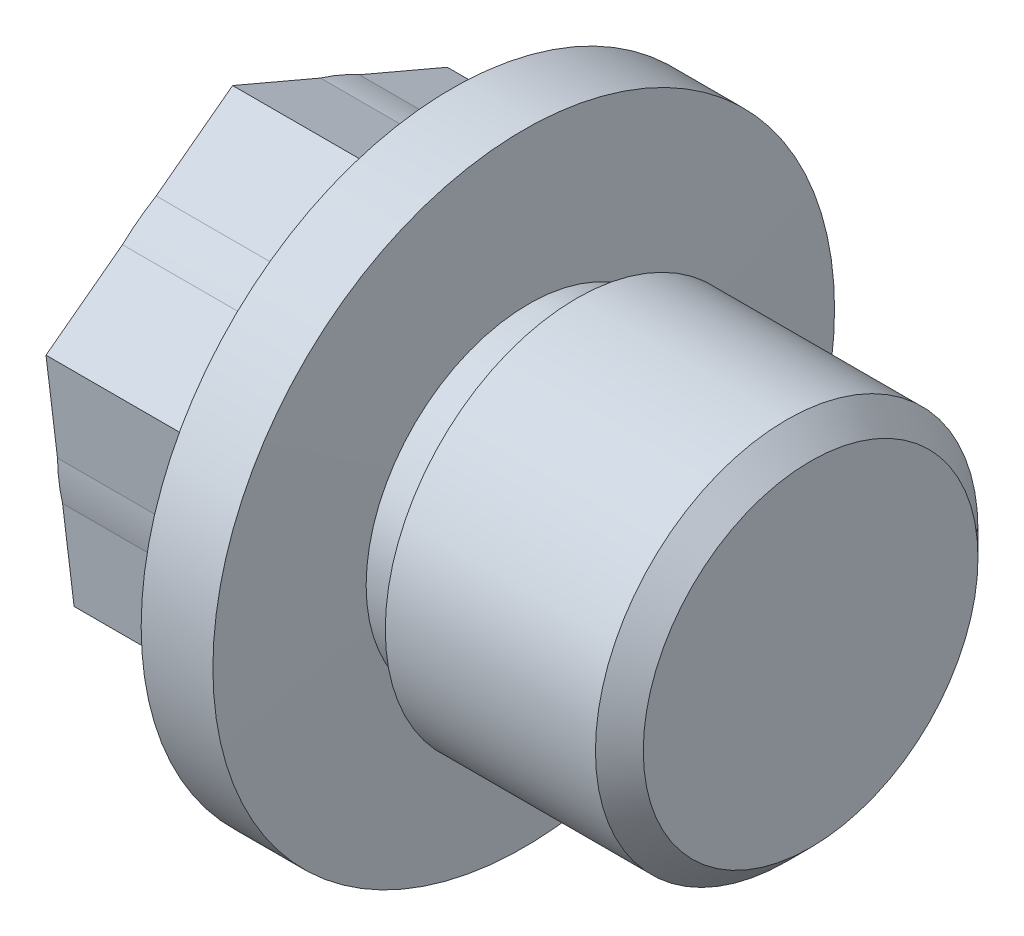
ISO-10303-21;
HEADER;
FILE_DESCRIPTION(('STEP AP214'),'2;1');
FILE_NAME('part.step','',(''),(''),'','','');
FILE_SCHEMA(('AUTOMOTIVE_DESIGN { 1 0 10303 214 1 1 1 1 }'));
ENDSEC;
DATA;
#1=APPLICATION_CONTEXT('core data for automotive mechanical design processes');
#2=APPLICATION_PROTOCOL_DEFINITION('international standard','automotive_design',2000,#1);
#3=PRODUCT_CONTEXT('',#1,'mechanical');
#4=PRODUCT('Part','Part','',(#3));
#5=PRODUCT_RELATED_PRODUCT_CATEGORY('part','',(#4));
#6=PRODUCT_DEFINITION_FORMATION('','',#4);
#7=PRODUCT_DEFINITION_CONTEXT('part definition',#1,'design');
#8=PRODUCT_DEFINITION('design','',#6,#7);
#9=PRODUCT_DEFINITION_SHAPE('','',#8);
#10=(LENGTH_UNIT() NAMED_UNIT(*) SI_UNIT(.MILLI.,.METRE.));
#11=(NAMED_UNIT(*) PLANE_ANGLE_UNIT() SI_UNIT($,.RADIAN.));
#12=(NAMED_UNIT(*) SI_UNIT($,.STERADIAN.) SOLID_ANGLE_UNIT());
#13=UNCERTAINTY_MEASURE_WITH_UNIT(LENGTH_MEASURE(1.E-05),#10,'distance_accuracy_value','');
#14=(GEOMETRIC_REPRESENTATION_CONTEXT(3) GLOBAL_UNCERTAINTY_ASSIGNED_CONTEXT((#13)) GLOBAL_UNIT_ASSIGNED_CONTEXT((#10,
#11,#12)) REPRESENTATION_CONTEXT('',''));
#15=CARTESIAN_POINT('',(0.,0.,0.));
#16=DIRECTION('',(0.,0.,1.));
#17=DIRECTION('',(1.,0.,0.));
#18=AXIS2_PLACEMENT_3D('',#15,#16,#17);
#19=CARTESIAN_POINT('',(0.,0.,0.));
#20=DIRECTION('',(-1.,0.,0.));
#21=DIRECTION('',(0.,0.,1.));
#22=AXIS2_PLACEMENT_3D('',#19,#20,#21);
#23=CYLINDRICAL_SURFACE('',#22,8.5);
#24=CARTESIAN_POINT('',(8.00000000000001,0.,0.));
#25=DIRECTION('',(-1.,0.,0.));
#26=DIRECTION('',(0.,0.,1.));
#27=AXIS2_PLACEMENT_3D('',#24,#25,#26);
#28=CIRCLE('',#27,8.5);
#29=CARTESIAN_POINT('',(8.00000000000001,-8.12297277686763,2.50346025857556));
#30=VERTEX_POINT('',#29);
#31=CARTESIAN_POINT('',(8.00000000000001,-7.43086157653214,4.1270202604807));
#32=VERTEX_POINT('',#31);
#33=EDGE_CURVE('E410',#30,#32,#28,.T.);
#34=ORIENTED_EDGE('',*,*,#33,.T.);
#35=DIRECTION('',(-1.,0.,0.));
#36=VECTOR('',#35,1.);
#37=CARTESIAN_POINT('',(0.,-7.43086157653215,4.12702026048069));
#38=LINE('',#37,#36);
#39=CARTESIAN_POINT('',(0.,-7.43086157653215,4.12702026048069));
#40=VERTEX_POINT('',#39);
#41=EDGE_CURVE('E295',#32,#40,#38,.T.);
#42=ORIENTED_EDGE('',*,*,#41,.T.);
#43=CARTESIAN_POINT('',(0.,0.,0.));
#44=DIRECTION('',(-1.,0.,0.));
#45=DIRECTION('',(0.,0.,1.));
#46=AXIS2_PLACEMENT_3D('',#43,#44,#45);
#47=CIRCLE('',#46,8.5);
#48=CARTESIAN_POINT('',(0.,-8.12297277686763,2.50346025857558));
#49=VERTEX_POINT('',#48);
#50=EDGE_CURVE('E453',#49,#40,#47,.T.);
#51=ORIENTED_EDGE('',*,*,#50,.F.);
#52=DIRECTION('',(-1.,0.,0.));
#53=VECTOR('',#52,1.);
#54=CARTESIAN_POINT('',(0.,-8.12297277686763,2.50346025857558));
#55=LINE('',#54,#53);
#56=EDGE_CURVE('E286',#49,#30,#55,.F.);
#57=ORIENTED_EDGE('',*,*,#56,.T.);
#58=EDGE_LOOP('',(#34,#42,#51,#57));
#59=FACE_BOUND('',#58,.T.);
#60=ADVANCED_FACE('F47',(#59),#23,.T.);
#61=CARTESIAN_POINT('',(8.00000000000001,-1.89342620714258,8.28643090830458));
#62=VERTEX_POINT('',#61);
#63=CARTESIAN_POINT('',(8.00000000000001,-0.141326400756689,8.49882502752287));
#64=VERTEX_POINT('',#63);
#65=EDGE_CURVE('E316',#62,#64,#28,.T.);
#66=ORIENTED_EDGE('',*,*,#65,.T.);
#67=DIRECTION('',(-1.,0.,0.));
#68=VECTOR('',#67,1.);
#69=CARTESIAN_POINT('',(0.,-0.141326400756724,8.49882502752287));
#70=LINE('',#69,#68);
#71=CARTESIAN_POINT('',(0.,-0.141326400756724,8.49882502752287));
#72=VERTEX_POINT('',#71);
#73=EDGE_CURVE('E284',#64,#72,#70,.T.);
#74=ORIENTED_EDGE('',*,*,#73,.T.);
#75=CARTESIAN_POINT('',(0.,-1.89342620714256,8.28643090830462));
#76=VERTEX_POINT('',#75);
#77=EDGE_CURVE('E321',#76,#72,#47,.T.);
#78=ORIENTED_EDGE('',*,*,#77,.F.);
#79=DIRECTION('',(-1.,0.,0.));
#80=VECTOR('',#79,1.);
#81=CARTESIAN_POINT('',(0.,-1.89342620714256,8.28643090830462));
#82=LINE('',#81,#80);
#83=EDGE_CURVE('E278',#76,#62,#82,.F.);
#84=ORIENTED_EDGE('',*,*,#83,.T.);
#85=EDGE_LOOP('',(#66,#74,#78,#84));
#86=FACE_BOUND('',#85,.T.);
#87=ADVANCED_FACE('F366',(#86),#23,.T.);
#88=CARTESIAN_POINT('',(8.00000000000001,6.22954656972507,5.78297064972906));
#89=VERTEX_POINT('',#88);
#90=CARTESIAN_POINT('',(8.00000000000001,7.28953517577547,4.37180476704223));
#91=VERTEX_POINT('',#90);
#92=EDGE_CURVE('E320',#89,#91,#28,.T.);
#93=ORIENTED_EDGE('',*,*,#92,.T.);
#94=DIRECTION('',(-1.,0.,0.));
#95=VECTOR('',#94,1.);
#96=CARTESIAN_POINT('',(0.,7.28953517577547,4.37180476704223));
#97=LINE('',#96,#95);
#98=CARTESIAN_POINT('',(0.,7.28953517577547,4.37180476704223));
#99=VERTEX_POINT('',#98);
#100=EDGE_CURVE('E277',#91,#99,#97,.T.);
#101=ORIENTED_EDGE('',*,*,#100,.T.);
#102=CARTESIAN_POINT('',(0.,6.22954656972507,5.78297064972906));
#103=VERTEX_POINT('',#102);
#104=EDGE_CURVE('E323',#103,#99,#47,.T.);
#105=ORIENTED_EDGE('',*,*,#104,.F.);
#106=DIRECTION('',(-1.,0.,0.));
#107=VECTOR('',#106,1.);
#108=CARTESIAN_POINT('',(0.,6.22954656972507,5.78297064972906));
#109=LINE('',#108,#107);
#110=EDGE_CURVE('E275',#103,#89,#109,.F.);
#111=ORIENTED_EDGE('',*,*,#110,.T.);
#112=EDGE_LOOP('',(#93,#101,#105,#111));
#113=FACE_BOUND('',#112,.T.);
#114=ADVANCED_FACE('F374',(#113),#23,.T.);
#115=CARTESIAN_POINT('',(8.00000000000001,8.12297277686767,-2.50346025857556));
#116=VERTEX_POINT('',#115);
#117=CARTESIAN_POINT('',(8.00000000000001,7.43086157653216,-4.12702026048067));
#118=VERTEX_POINT('',#117);
#119=EDGE_CURVE('E325',#116,#118,#28,.T.);
#120=ORIENTED_EDGE('',*,*,#119,.T.);
#121=DIRECTION('',(-1.,0.,0.));
#122=VECTOR('',#121,1.);
#123=CARTESIAN_POINT('',(0.,7.43086157653216,-4.12702026048067));
#124=LINE('',#123,#122);
#125=CARTESIAN_POINT('',(0.,7.43086157653216,-4.12702026048067));
#126=VERTEX_POINT('',#125);
#127=EDGE_CURVE('E268',#118,#126,#124,.T.);
#128=ORIENTED_EDGE('',*,*,#127,.T.);
#129=CARTESIAN_POINT('',(0.,8.12297277686767,-2.50346025857556));
#130=VERTEX_POINT('',#129);
#131=EDGE_CURVE('E330',#130,#126,#47,.T.);
#132=ORIENTED_EDGE('',*,*,#131,.F.);
#133=DIRECTION('',(-1.,0.,0.));
#134=VECTOR('',#133,1.);
#135=CARTESIAN_POINT('',(0.,8.12297277686767,-2.50346025857556));
#136=LINE('',#135,#134);
#137=EDGE_CURVE('E262',#130,#116,#136,.F.);
#138=ORIENTED_EDGE('',*,*,#137,.T.);
#139=EDGE_LOOP('',(#120,#128,#132,#138));
#140=FACE_BOUND('',#139,.T.);
#141=ADVANCED_FACE('F393',(#140),#23,.T.);
#142=CARTESIAN_POINT('',(8.00000000000001,1.89342620714259,-8.28643090830458));
#143=VERTEX_POINT('',#142);
#144=CARTESIAN_POINT('',(8.00000000000001,0.141326400756751,-8.49882502752286));
#145=VERTEX_POINT('',#144);
#146=EDGE_CURVE('E399',#143,#145,#28,.T.);
#147=ORIENTED_EDGE('',*,*,#146,.T.);
#148=DIRECTION('',(-1.,0.,0.));
#149=VECTOR('',#148,1.);
#150=CARTESIAN_POINT('',(0.,0.141326400756703,-8.49882502752283));
#151=LINE('',#150,#149);
#152=CARTESIAN_POINT('',(0.,0.141326400756703,-8.49882502752283));
#153=VERTEX_POINT('',#152);
#154=EDGE_CURVE('E261',#145,#153,#151,.T.);
#155=ORIENTED_EDGE('',*,*,#154,.T.);
#156=CARTESIAN_POINT('',(0.,1.89342620714262,-8.28643090830457));
#157=VERTEX_POINT('',#156);
#158=EDGE_CURVE('E190',#157,#153,#47,.T.);
#159=ORIENTED_EDGE('',*,*,#158,.F.);
#160=DIRECTION('',(-1.,0.,0.));
#161=VECTOR('',#160,1.);
#162=CARTESIAN_POINT('',(0.,1.89342620714262,-8.28643090830457));
#163=LINE('',#162,#161);
#164=EDGE_CURVE('E260',#157,#143,#163,.F.);
#165=ORIENTED_EDGE('',*,*,#164,.T.);
#166=EDGE_LOOP('',(#147,#155,#159,#165));
#167=FACE_BOUND('',#166,.T.);
#168=ADVANCED_FACE('F385',(#167),#23,.T.);
#169=CARTESIAN_POINT('',(0.,0.,0.));
#170=DIRECTION('',(1.,0.,0.));
#171=DIRECTION('',(0.,0.,-1.));
#172=AXIS2_PLACEMENT_3D('',#169,#170,#171);
#173=PLANE('',#172);
#174=CARTESIAN_POINT('',(0.,-6.22954656972502,-5.78297064972902));
#175=VERTEX_POINT('',#174);
#176=CARTESIAN_POINT('',(0.,-7.28953517577544,-4.37180476704217));
#177=VERTEX_POINT('',#176);
#178=EDGE_CURVE('E450',#175,#177,#47,.T.);
#179=ORIENTED_EDGE('',*,*,#178,.T.);
#180=DIRECTION('',(0.,-0.600585180639857,0.799560779925945));
#181=VECTOR('',#180,1.);
#182=CARTESIAN_POINT('',(0.,-6.75954087275023,-5.0773877083856));
#183=LINE('',#182,#181);
#184=CARTESIAN_POINT('',(0.,-9.69097203296675,-1.17476496590499));
#185=VERTEX_POINT('',#184);
#186=EDGE_CURVE('E209',#177,#185,#183,.T.);
#187=ORIENTED_EDGE('',*,*,#186,.T.);
#188=DIRECTION('',(0.,0.392147356965642,0.919902413533558));
#189=VECTOR('',#188,1.);
#190=CARTESIAN_POINT('',(0.,-7.77691717669989,3.31524025952815));
#191=LINE('',#190,#189);
#192=EDGE_CURVE('E214',#185,#49,#191,.T.);
#193=ORIENTED_EDGE('',*,*,#192,.T.);
#194=ORIENTED_EDGE('',*,*,#50,.T.);
#195=CARTESIAN_POINT('',(0.,-5.86286232043304,7.80524548496124));
#196=VERTEX_POINT('',#195);
#197=EDGE_CURVE('E207',#40,#196,#191,.T.);
#198=ORIENTED_EDGE('',*,*,#197,.T.);
#199=DIRECTION('',(0.,0.992732537605499,0.120341633607613));
#200=VECTOR('',#199,1.);
#201=CARTESIAN_POINT('',(0.,-1.01737630394962,8.39262796791378));
#202=LINE('',#201,#200);
#203=EDGE_CURVE('E430',#196,#76,#202,.T.);
#204=ORIENTED_EDGE('',*,*,#203,.T.);
#205=ORIENTED_EDGE('',*,*,#77,.T.);
#206=CARTESIAN_POINT('',(0.,3.82810971253376,8.98001045086626));
#207=VERTEX_POINT('',#206);
#208=EDGE_CURVE('E424',#72,#207,#202,.T.);
#209=ORIENTED_EDGE('',*,*,#208,.T.);
#210=DIRECTION('',(0.,0.600585180639857,-0.799560779925945));
#211=VECTOR('',#210,1.);
#212=CARTESIAN_POINT('',(0.,6.75954087275024,5.0773877083856));
#213=LINE('',#212,#211);
#214=EDGE_CURVE('E434',#207,#103,#213,.T.);
#215=ORIENTED_EDGE('',*,*,#214,.T.);
#216=ORIENTED_EDGE('',*,*,#104,.T.);
#217=CARTESIAN_POINT('',(0.,9.69097203296677,1.17476496590502));
#218=VERTEX_POINT('',#217);
#219=EDGE_CURVE('E435',#99,#218,#213,.T.);
#220=ORIENTED_EDGE('',*,*,#219,.T.);
#221=DIRECTION('',(0.,-0.392147356965642,-0.919902413533558));
#222=VECTOR('',#221,1.);
#223=CARTESIAN_POINT('',(0.,7.77691717669993,-3.3152402595281));
#224=LINE('',#223,#222);
#225=EDGE_CURVE('E195',#218,#130,#224,.T.);
#226=ORIENTED_EDGE('',*,*,#225,.T.);
#227=ORIENTED_EDGE('',*,*,#131,.T.);
#228=CARTESIAN_POINT('',(0.,5.86286232043304,-7.80524548496124));
#229=VERTEX_POINT('',#228);
#230=EDGE_CURVE('E437',#126,#229,#224,.T.);
#231=ORIENTED_EDGE('',*,*,#230,.T.);
#232=DIRECTION('',(0.,-0.992732537605499,-0.120341633607613));
#233=VECTOR('',#232,1.);
#234=CARTESIAN_POINT('',(0.,1.01737630394968,-8.39262796791372));
#235=LINE('',#234,#233);
#236=EDGE_CURVE('E193',#229,#157,#235,.T.);
#237=ORIENTED_EDGE('',*,*,#236,.T.);
#238=ORIENTED_EDGE('',*,*,#158,.T.);
#239=CARTESIAN_POINT('',(0.,-3.82810971253371,-8.98001045086623));
#240=VERTEX_POINT('',#239);
#241=EDGE_CURVE('E176',#153,#240,#235,.T.);
#242=ORIENTED_EDGE('',*,*,#241,.T.);
#243=EDGE_CURVE('E181',#240,#175,#183,.T.);
#244=ORIENTED_EDGE('',*,*,#243,.T.);
#245=EDGE_LOOP('',(#179,#187,#193,#194,#198,#204,#205,#209,#215,#216,#220,#226,#227,#231,#237,
#238,#242,#244));
#246=FACE_BOUND('',#245,.T.);
#247=ADVANCED_FACE('F182',(#246),#173,.F.);
#248=CARTESIAN_POINT('',(8.00000000000001,-6.22954656972502,-5.78297064972902));
#249=VERTEX_POINT('',#248);
#250=CARTESIAN_POINT('',(8.00000000000001,-7.28953517577544,-4.37180476704217));
#251=VERTEX_POINT('',#250);
#252=EDGE_CURVE('E405',#249,#251,#28,.T.);
#253=ORIENTED_EDGE('',*,*,#252,.T.);
#254=DIRECTION('',(-1.,0.,0.));
#255=VECTOR('',#254,1.);
#256=CARTESIAN_POINT('',(0.,-7.28953517577544,-4.37180476704217));
#257=LINE('',#256,#255);
#258=EDGE_CURVE('E251',#251,#177,#257,.T.);
#259=ORIENTED_EDGE('',*,*,#258,.T.);
#260=ORIENTED_EDGE('',*,*,#178,.F.);
#261=DIRECTION('',(-1.,0.,0.));
#262=VECTOR('',#261,1.);
#263=CARTESIAN_POINT('',(0.,-6.22954656972502,-5.78297064972902));
#264=LINE('',#263,#262);
#265=EDGE_CURVE('E210',#175,#249,#264,.F.);
#266=ORIENTED_EDGE('',*,*,#265,.T.);
#267=EDGE_LOOP('',(#253,#259,#260,#266));
#268=FACE_BOUND('',#267,.T.);
#269=ADVANCED_FACE('F371',(#268),#23,.T.);
#270=CARTESIAN_POINT('',(8.00000000000001,8.50000000000001,0.));
#271=DIRECTION('',(1.,0.,0.));
#272=DIRECTION('',(0.,0.,-1.));
#273=AXIS2_PLACEMENT_3D('',#270,#271,#272);
#274=PLANE('',#273);
#275=DIRECTION('',(0.,0.9927325376055,0.120341633607613));
#276=VECTOR('',#275,1.);
#277=CARTESIAN_POINT('',(8.00000000000001,-1.01737630394962,8.39262796791378));
#278=LINE('',#277,#276);
#279=CARTESIAN_POINT('',(8.00000000000001,-5.86286232043304,7.80524548496124));
#280=VERTEX_POINT('',#279);
#281=EDGE_CURVE('E232',#280,#62,#278,.T.);
#282=ORIENTED_EDGE('',*,*,#281,.F.);
#283=DIRECTION('',(0.,-0.392147356965642,-0.919902413533558));
#284=VECTOR('',#283,1.);
#285=CARTESIAN_POINT('',(8.00000000000001,-6.46979100531123,6.38150731066287));
#286=LINE('',#285,#284);
#287=EDGE_CURVE('E333',#280,#32,#286,.T.);
#288=ORIENTED_EDGE('',*,*,#287,.T.);
#289=ORIENTED_EDGE('',*,*,#33,.F.);
#290=DIRECTION('',(0.,0.392147356965642,0.919902413533558));
#291=VECTOR('',#290,1.);
#292=CARTESIAN_POINT('',(8.00000000000001,-7.77691717669989,3.31524025952815));
#293=LINE('',#292,#291);
#294=CARTESIAN_POINT('',(8.00000000000001,-9.69097203296675,-1.17476496590499));
#295=VERTEX_POINT('',#294);
#296=EDGE_CURVE('E218',#295,#30,#293,.T.);
#297=ORIENTED_EDGE('',*,*,#296,.F.);
#298=DIRECTION('',(0.,0.600585180639857,-0.799560779925945));
#299=VECTOR('',#298,1.);
#300=CARTESIAN_POINT('',(8.00000000000001,-3.69356911951445,-9.15912472966275));
#301=LINE('',#300,#299);
#302=EDGE_CURVE('E327',#295,#251,#301,.T.);
#303=ORIENTED_EDGE('',*,*,#302,.T.);
#304=ORIENTED_EDGE('',*,*,#252,.F.);
#305=DIRECTION('',(0.,-0.600585180639857,0.799560779925945));
#306=VECTOR('',#305,1.);
#307=CARTESIAN_POINT('',(8.00000000000001,-6.75954087275023,-5.0773877083856));
#308=LINE('',#307,#306);
#309=CARTESIAN_POINT('',(8.00000000000001,-3.82810971253371,-8.98001045086623));
#310=VERTEX_POINT('',#309);
#311=EDGE_CURVE('E205',#310,#249,#308,.T.);
#312=ORIENTED_EDGE('',*,*,#311,.F.);
#313=DIRECTION('',(0.,0.992732537605499,0.120341633607613));
#314=VECTOR('',#313,1.);
#315=CARTESIAN_POINT('',(8.00000000000001,9.3942783793252,-7.37715799777129));
#316=LINE('',#315,#314);
#317=EDGE_CURVE('E196',#310,#145,#316,.T.);
#318=ORIENTED_EDGE('',*,*,#317,.T.);
#319=ORIENTED_EDGE('',*,*,#146,.F.);
#320=DIRECTION('',(0.,-0.992732537605499,-0.120341633607613));
#321=VECTOR('',#320,1.);
#322=CARTESIAN_POINT('',(8.00000000000001,1.01737630394968,-8.39262796791372));
#323=LINE('',#322,#321);
#324=CARTESIAN_POINT('',(8.00000000000001,5.86286232043304,-7.80524548496124));
#325=VERTEX_POINT('',#324);
#326=EDGE_CURVE('E201',#325,#143,#323,.T.);
#327=ORIENTED_EDGE('',*,*,#326,.F.);
#328=DIRECTION('',(0.,0.392147356965642,0.919902413533558));
#329=VECTOR('',#328,1.);
#330=CARTESIAN_POINT('',(8.00000000000001,9.08404334808859,-0.248973208393385));
#331=LINE('',#330,#329);
#332=EDGE_CURVE('E335',#325,#118,#331,.T.);
#333=ORIENTED_EDGE('',*,*,#332,.T.);
#334=ORIENTED_EDGE('',*,*,#119,.F.);
#335=DIRECTION('',(0.,-0.392147356965642,-0.919902413533558));
#336=VECTOR('',#335,1.);
#337=CARTESIAN_POINT('',(8.00000000000001,7.77691717669993,-3.3152402595281));
#338=LINE('',#337,#336);
#339=CARTESIAN_POINT('',(8.00000000000001,9.69097203296677,1.17476496590498));
#340=VERTEX_POINT('',#339);
#341=EDGE_CURVE('E226',#340,#116,#338,.T.);
#342=ORIENTED_EDGE('',*,*,#341,.F.);
#343=DIRECTION('',(0.,-0.600585180639857,0.799560779925945));
#344=VECTOR('',#343,1.);
#345=CARTESIAN_POINT('',(8.00000000000001,9.82551262598604,0.995650687108454));
#346=LINE('',#345,#344);
#347=EDGE_CURVE('E341',#340,#91,#346,.T.);
#348=ORIENTED_EDGE('',*,*,#347,.T.);
#349=ORIENTED_EDGE('',*,*,#92,.F.);
#350=DIRECTION('',(0.,0.600585180639857,-0.799560779925945));
#351=VECTOR('',#350,1.);
#352=CARTESIAN_POINT('',(8.00000000000001,6.75954087275024,5.0773877083856));
#353=LINE('',#352,#351);
#354=CARTESIAN_POINT('',(8.00000000000001,3.82810971253376,8.98001045086626));
#355=VERTEX_POINT('',#354);
#356=EDGE_CURVE('E235',#355,#89,#353,.T.);
#357=ORIENTED_EDGE('',*,*,#356,.F.);
#358=DIRECTION('',(0.,-0.9927325376055,-0.120341633607613));
#359=VECTOR('',#358,1.);
#360=CARTESIAN_POINT('',(8.00000000000001,7.35952577142594,9.40809793805621));
#361=LINE('',#360,#359);
#362=EDGE_CURVE('E339',#355,#64,#361,.T.);
#363=ORIENTED_EDGE('',*,*,#362,.T.);
#364=ORIENTED_EDGE('',*,*,#65,.F.);
#365=EDGE_LOOP('',(#282,#288,#289,#297,#303,#304,#312,#318,#319,#327,#333,#334,#342,#348,#349,
#357,#363,#364));
#366=FACE_BOUND('',#365,.T.);
#367=CARTESIAN_POINT('',(8.00000000000001,0.,0.));
#368=DIRECTION('',(-1.,0.,0.));
#369=DIRECTION('',(0.,0.,1.));
#370=AXIS2_PLACEMENT_3D('',#367,#368,#369);
#371=CIRCLE('',#370,13.);
#372=CARTESIAN_POINT('',(8.00000000000001,0.,13.));
#373=VERTEX_POINT('',#372);
#374=EDGE_CURVE('E315',#373,#373,#371,.T.);
#375=ORIENTED_EDGE('',*,*,#374,.T.);
#376=EDGE_LOOP('',(#375));
#377=FACE_BOUND('',#376,.T.);
#378=ADVANCED_FACE('F379',(#366,#377),#274,.F.);
#379=CARTESIAN_POINT('',(0.,0.,0.));
#380=DIRECTION('',(-1.,0.,0.));
#381=DIRECTION('',(0.,0.,1.));
#382=AXIS2_PLACEMENT_3D('',#379,#380,#381);
#383=CYLINDRICAL_SURFACE('',#382,13.);
#384=ORIENTED_EDGE('',*,*,#374,.F.);
#385=EDGE_LOOP('',(#384));
#386=FACE_BOUND('',#385,.T.);
#387=CARTESIAN_POINT('',(11.,0.,0.));
#388=DIRECTION('',(-1.,0.,0.));
#389=DIRECTION('',(0.,0.,1.));
#390=AXIS2_PLACEMENT_3D('',#387,#388,#389);
#391=CIRCLE('',#390,13.);
#392=CARTESIAN_POINT('',(11.,0.,13.));
#393=VERTEX_POINT('',#392);
#394=EDGE_CURVE('E306',#393,#393,#391,.T.);
#395=ORIENTED_EDGE('',*,*,#394,.T.);
#396=EDGE_LOOP('',(#395));
#397=FACE_BOUND('',#396,.T.);
#398=ADVANCED_FACE('F390',(#386,#397),#383,.T.);
#399=CARTESIAN_POINT('',(11.2092653547601,0.,0.));
#400=DIRECTION('',(-1.,0.,0.));
#401=DIRECTION('',(0.,0.,1.));
#402=AXIS2_PLACEMENT_3D('',#399,#400,#401);
#403=CONICAL_SURFACE('',#402,6.8,1.53705665874102);
#404=ORIENTED_EDGE('',*,*,#394,.F.);
#405=EDGE_LOOP('',(#404));
#406=FACE_BOUND('',#405,.T.);
#407=CARTESIAN_POINT('',(11.2092653547601,0.,0.));
#408=DIRECTION('',(-1.,0.,0.));
#409=DIRECTION('',(0.,0.,1.));
#410=AXIS2_PLACEMENT_3D('',#407,#408,#409);
#411=CIRCLE('',#410,6.8);
#412=CARTESIAN_POINT('',(11.2092653547601,0.,6.8));
#413=VERTEX_POINT('',#412);
#414=EDGE_CURVE('E304',#413,#413,#411,.T.);
#415=ORIENTED_EDGE('',*,*,#414,.T.);
#416=EDGE_LOOP('',(#415));
#417=FACE_BOUND('',#416,.T.);
#418=ADVANCED_FACE('F494',(#406,#417),#403,.T.);
#419=CARTESIAN_POINT('',(0.,0.,0.));
#420=DIRECTION('',(-1.,0.,0.));
#421=DIRECTION('',(0.,0.,1.));
#422=AXIS2_PLACEMENT_3D('',#419,#420,#421);
#423=CYLINDRICAL_SURFACE('',#422,6.8);
#424=ORIENTED_EDGE('',*,*,#414,.F.);
#425=EDGE_LOOP('',(#424));
#426=FACE_BOUND('',#425,.T.);
#427=CARTESIAN_POINT('',(13.2092653547601,0.,0.));
#428=DIRECTION('',(-1.,0.,0.));
#429=DIRECTION('',(0.,0.,1.));
#430=AXIS2_PLACEMENT_3D('',#427,#428,#429);
#431=CIRCLE('',#430,6.8);
#432=CARTESIAN_POINT('',(13.2092653547601,0.,6.8));
#433=VERTEX_POINT('',#432);
#434=EDGE_CURVE('E297',#433,#433,#431,.T.);
#435=ORIENTED_EDGE('',*,*,#434,.T.);
#436=EDGE_LOOP('',(#435));
#437=FACE_BOUND('',#436,.T.);
#438=ADVANCED_FACE('F491',(#426,#437),#423,.T.);
#439=CARTESIAN_POINT('',(13.2092653547601,6.8,0.));
#440=DIRECTION('',(1.,0.,0.));
#441=DIRECTION('',(0.,0.,-1.));
#442=AXIS2_PLACEMENT_3D('',#439,#440,#441);
#443=PLANE('',#442);
#444=ORIENTED_EDGE('',*,*,#434,.F.);
#445=EDGE_LOOP('',(#444));
#446=FACE_BOUND('',#445,.T.);
#447=CARTESIAN_POINT('',(13.2092653547601,0.,0.));
#448=DIRECTION('',(-1.,0.,0.));
#449=DIRECTION('',(0.,0.,1.));
#450=AXIS2_PLACEMENT_3D('',#447,#448,#449);
#451=CIRCLE('',#450,8.);
#452=CARTESIAN_POINT('',(13.2092653547601,0.,8.));
#453=VERTEX_POINT('',#452);
#454=EDGE_CURVE('E298',#453,#453,#451,.T.);
#455=ORIENTED_EDGE('',*,*,#454,.T.);
#456=EDGE_LOOP('',(#455));
#457=FACE_BOUND('',#456,.T.);
#458=ADVANCED_FACE('F486',(#446,#457),#443,.F.);
#459=CARTESIAN_POINT('',(0.,0.,0.));
#460=DIRECTION('',(-1.,0.,0.));
#461=DIRECTION('',(0.,0.,1.));
#462=AXIS2_PLACEMENT_3D('',#459,#460,#461);
#463=CYLINDRICAL_SURFACE('',#462,8.);
#464=CARTESIAN_POINT('',(22.,0.,0.));
#465=DIRECTION('',(-1.,0.,0.));
#466=DIRECTION('',(0.,0.,1.));
#467=AXIS2_PLACEMENT_3D('',#464,#465,#466);
#468=CIRCLE('',#467,8.);
#469=CARTESIAN_POINT('',(22.,0.,8.));
#470=VERTEX_POINT('',#469);
#471=EDGE_CURVE('E56',#470,#470,#468,.T.);
#472=ORIENTED_EDGE('',*,*,#471,.T.);
#473=EDGE_LOOP('',(#472));
#474=FACE_BOUND('',#473,.T.);
#475=ORIENTED_EDGE('',*,*,#454,.F.);
#476=EDGE_LOOP('',(#475));
#477=FACE_BOUND('',#476,.T.);
#478=ADVANCED_FACE('F354',(#474,#477),#463,.T.);
#479=CARTESIAN_POINT('',(23.,8.00000000000004,0.));
#480=DIRECTION('',(-1.,0.,0.));
#481=DIRECTION('',(0.,0.,1.));
#482=AXIS2_PLACEMENT_3D('',#479,#480,#481);
#483=PLANE('',#482);
#484=CARTESIAN_POINT('',(23.,0.,0.));
#485=DIRECTION('',(-1.,0.,0.));
#486=DIRECTION('',(0.,0.,1.));
#487=AXIS2_PLACEMENT_3D('',#484,#485,#486);
#488=CIRCLE('',#487,7.);
#489=CARTESIAN_POINT('',(23.,0.,7.));
#490=VERTEX_POINT('',#489);
#491=EDGE_CURVE('E11',#490,#490,#488,.F.);
#492=ORIENTED_EDGE('',*,*,#491,.T.);
#493=EDGE_LOOP('',(#492));
#494=FACE_BOUND('',#493,.T.);
#495=ADVANCED_FACE('F480',(#494),#483,.F.);
#496=CARTESIAN_POINT('',(34.4238927216571,-6.75954087275023,-5.0773877083856));
#497=DIRECTION('',(0.,-0.799560779925949,-0.600585180639861));
#498=DIRECTION('',(0.,0.600585180639857,-0.799560779925945));
#499=AXIS2_PLACEMENT_3D('',#496,#497,#498);
#500=PLANE('',#499);
#501=ORIENTED_EDGE('',*,*,#265,.F.);
#502=ORIENTED_EDGE('',*,*,#243,.F.);
#503=DIRECTION('',(-1.,0.,0.));
#504=VECTOR('',#503,1.);
#505=CARTESIAN_POINT('',(34.4238927216571,-3.8281097125337,-8.98001045086623));
#506=LINE('',#505,#504);
#507=EDGE_CURVE('E192',#310,#240,#506,.T.);
#508=ORIENTED_EDGE('',*,*,#507,.F.);
#509=ORIENTED_EDGE('',*,*,#311,.T.);
#510=EDGE_LOOP('',(#501,#502,#508,#509));
#511=FACE_BOUND('',#510,.T.);
#512=ADVANCED_FACE('F202',(#511),#500,.T.);
#513=CARTESIAN_POINT('',(34.4238927216571,1.01737630394968,-8.39262796791372));
#514=DIRECTION('',(0.,0.120341633607608,-0.992732537605498));
#515=DIRECTION('',(0.,0.992732537605499,0.120341633607613));
#516=AXIS2_PLACEMENT_3D('',#513,#514,#515);
#517=PLANE('',#516);
#518=ORIENTED_EDGE('',*,*,#154,.F.);
#519=ORIENTED_EDGE('',*,*,#317,.F.);
#520=ORIENTED_EDGE('',*,*,#507,.T.);
#521=ORIENTED_EDGE('',*,*,#241,.F.);
#522=EDGE_LOOP('',(#518,#519,#520,#521));
#523=FACE_BOUND('',#522,.T.);
#524=ADVANCED_FACE('F198',(#523),#517,.T.);
#525=ORIENTED_EDGE('',*,*,#258,.F.);
#526=ORIENTED_EDGE('',*,*,#302,.F.);
#527=DIRECTION('',(-1.,0.,0.));
#528=VECTOR('',#527,1.);
#529=CARTESIAN_POINT('',(34.4238927216571,-9.69097203296675,-1.17476496590499));
#530=LINE('',#529,#528);
#531=EDGE_CURVE('E221',#295,#185,#530,.T.);
#532=ORIENTED_EDGE('',*,*,#531,.T.);
#533=ORIENTED_EDGE('',*,*,#186,.F.);
#534=EDGE_LOOP('',(#525,#526,#532,#533));
#535=FACE_BOUND('',#534,.T.);
#536=ADVANCED_FACE('F468',(#535),#500,.T.);
#537=CARTESIAN_POINT('',(34.4238927216571,-7.77691717669989,3.31524025952815));
#538=DIRECTION('',(0.,-0.919902413533557,0.392147356965637));
#539=DIRECTION('',(0.,-0.392147356965642,-0.919902413533558));
#540=AXIS2_PLACEMENT_3D('',#537,#538,#539);
#541=PLANE('',#540);
#542=ORIENTED_EDGE('',*,*,#56,.F.);
#543=ORIENTED_EDGE('',*,*,#192,.F.);
#544=ORIENTED_EDGE('',*,*,#531,.F.);
#545=ORIENTED_EDGE('',*,*,#296,.T.);
#546=EDGE_LOOP('',(#542,#543,#544,#545));
#547=FACE_BOUND('',#546,.T.);
#548=ADVANCED_FACE('F461',(#547),#541,.T.);
#549=ORIENTED_EDGE('',*,*,#164,.F.);
#550=ORIENTED_EDGE('',*,*,#236,.F.);
#551=DIRECTION('',(-1.,0.,0.));
#552=VECTOR('',#551,1.);
#553=CARTESIAN_POINT('',(34.4238927216571,5.86286232043304,-7.80524548496124));
#554=LINE('',#553,#552);
#555=EDGE_CURVE('E230',#325,#229,#554,.T.);
#556=ORIENTED_EDGE('',*,*,#555,.F.);
#557=ORIENTED_EDGE('',*,*,#326,.T.);
#558=EDGE_LOOP('',(#549,#550,#556,#557));
#559=FACE_BOUND('',#558,.T.);
#560=ADVANCED_FACE('F471',(#559),#517,.T.);
#561=CARTESIAN_POINT('',(34.4238927216571,7.77691717669993,-3.3152402595281));
#562=DIRECTION('',(0.,0.919902413533557,-0.392147356965637));
#563=DIRECTION('',(0.,0.392147356965642,0.919902413533558));
#564=AXIS2_PLACEMENT_3D('',#561,#562,#563);
#565=PLANE('',#564);
#566=ORIENTED_EDGE('',*,*,#127,.F.);
#567=ORIENTED_EDGE('',*,*,#332,.F.);
#568=ORIENTED_EDGE('',*,*,#555,.T.);
#569=ORIENTED_EDGE('',*,*,#230,.F.);
#570=EDGE_LOOP('',(#566,#567,#568,#569));
#571=FACE_BOUND('',#570,.T.);
#572=ADVANCED_FACE('F625',(#571),#565,.T.);
#573=ORIENTED_EDGE('',*,*,#137,.F.);
#574=ORIENTED_EDGE('',*,*,#225,.F.);
#575=DIRECTION('',(-1.,0.,0.));
#576=VECTOR('',#575,1.);
#577=CARTESIAN_POINT('',(34.4238927216571,9.69097203296677,1.17476496590498));
#578=LINE('',#577,#576);
#579=EDGE_CURVE('E233',#340,#218,#578,.T.);
#580=ORIENTED_EDGE('',*,*,#579,.F.);
#581=ORIENTED_EDGE('',*,*,#341,.T.);
#582=EDGE_LOOP('',(#573,#574,#580,#581));
#583=FACE_BOUND('',#582,.T.);
#584=ADVANCED_FACE('F627',(#583),#565,.T.);
#585=CARTESIAN_POINT('',(34.4238927216571,6.75954087275024,5.0773877083856));
#586=DIRECTION('',(0.,0.799560779925949,0.600585180639861));
#587=DIRECTION('',(0.,-0.600585180639857,0.799560779925945));
#588=AXIS2_PLACEMENT_3D('',#585,#586,#587);
#589=PLANE('',#588);
#590=ORIENTED_EDGE('',*,*,#100,.F.);
#591=ORIENTED_EDGE('',*,*,#347,.F.);
#592=ORIENTED_EDGE('',*,*,#579,.T.);
#593=ORIENTED_EDGE('',*,*,#219,.F.);
#594=EDGE_LOOP('',(#590,#591,#592,#593));
#595=FACE_BOUND('',#594,.T.);
#596=ADVANCED_FACE('F639',(#595),#589,.T.);
#597=ORIENTED_EDGE('',*,*,#110,.F.);
#598=ORIENTED_EDGE('',*,*,#214,.F.);
#599=DIRECTION('',(-1.,0.,0.));
#600=VECTOR('',#599,1.);
#601=CARTESIAN_POINT('',(34.4238927216571,3.82810971253376,8.98001045086626));
#602=LINE('',#601,#600);
#603=EDGE_CURVE('E74',#355,#207,#602,.T.);
#604=ORIENTED_EDGE('',*,*,#603,.F.);
#605=ORIENTED_EDGE('',*,*,#356,.T.);
#606=EDGE_LOOP('',(#597,#598,#604,#605));
#607=FACE_BOUND('',#606,.T.);
#608=ADVANCED_FACE('F647',(#607),#589,.T.);
#609=CARTESIAN_POINT('',(34.4238927216571,-1.01737630394962,8.39262796791378));
#610=DIRECTION('',(0.,-0.120341633607608,0.992732537605498));
#611=DIRECTION('',(0.,-0.9927325376055,-0.120341633607613));
#612=AXIS2_PLACEMENT_3D('',#609,#610,#611);
#613=PLANE('',#612);
#614=ORIENTED_EDGE('',*,*,#73,.F.);
#615=ORIENTED_EDGE('',*,*,#362,.F.);
#616=ORIENTED_EDGE('',*,*,#603,.T.);
#617=ORIENTED_EDGE('',*,*,#208,.F.);
#618=EDGE_LOOP('',(#614,#615,#616,#617));
#619=FACE_BOUND('',#618,.T.);
#620=ADVANCED_FACE('F364',(#619),#613,.T.);
#621=ORIENTED_EDGE('',*,*,#41,.F.);
#622=ORIENTED_EDGE('',*,*,#287,.F.);
#623=DIRECTION('',(-1.,0.,0.));
#624=VECTOR('',#623,1.);
#625=CARTESIAN_POINT('',(34.4238927216571,-5.86286232043304,7.80524548496124));
#626=LINE('',#625,#624);
#627=EDGE_CURVE('E68',#280,#196,#626,.T.);
#628=ORIENTED_EDGE('',*,*,#627,.T.);
#629=ORIENTED_EDGE('',*,*,#197,.F.);
#630=EDGE_LOOP('',(#621,#622,#628,#629));
#631=FACE_BOUND('',#630,.T.);
#632=ADVANCED_FACE('F361',(#631),#541,.T.);
#633=ORIENTED_EDGE('',*,*,#83,.F.);
#634=ORIENTED_EDGE('',*,*,#203,.F.);
#635=ORIENTED_EDGE('',*,*,#627,.F.);
#636=ORIENTED_EDGE('',*,*,#281,.T.);
#637=EDGE_LOOP('',(#633,#634,#635,#636));
#638=FACE_BOUND('',#637,.T.);
#639=ADVANCED_FACE('F356',(#638),#613,.T.);
#640=CARTESIAN_POINT('',(22.,0.,0.));
#641=DIRECTION('',(-1.,0.,0.));
#642=DIRECTION('',(0.,0.,1.));
#643=AXIS2_PLACEMENT_3D('',#640,#641,#642);
#644=CONICAL_SURFACE('',#643,8.,0.785398163397452);
#645=ORIENTED_EDGE('',*,*,#491,.F.);
#646=EDGE_LOOP('',(#645));
#647=FACE_BOUND('',#646,.T.);
#648=ORIENTED_EDGE('',*,*,#471,.F.);
#649=EDGE_LOOP('',(#648));
#650=FACE_BOUND('',#649,.T.);
#651=ADVANCED_FACE('F55',(#647,#650),#644,.T.);
#652=CLOSED_SHELL('',(#60,#87,#114,#141,#168,#247,#269,#378,#398,#418,#438,#458,#478,#495,#512,
#524,#536,#548,#560,#572,#584,#596,#608,#620,#632,#639,#651));
#653=MANIFOLD_SOLID_BREP('B2',#652);
#654=ADVANCED_BREP_SHAPE_REPRESENTATION('',(#18,#653),#14);
#655=SHAPE_DEFINITION_REPRESENTATION(#9,#654);
ENDSEC;
END-ISO-10303-21;
